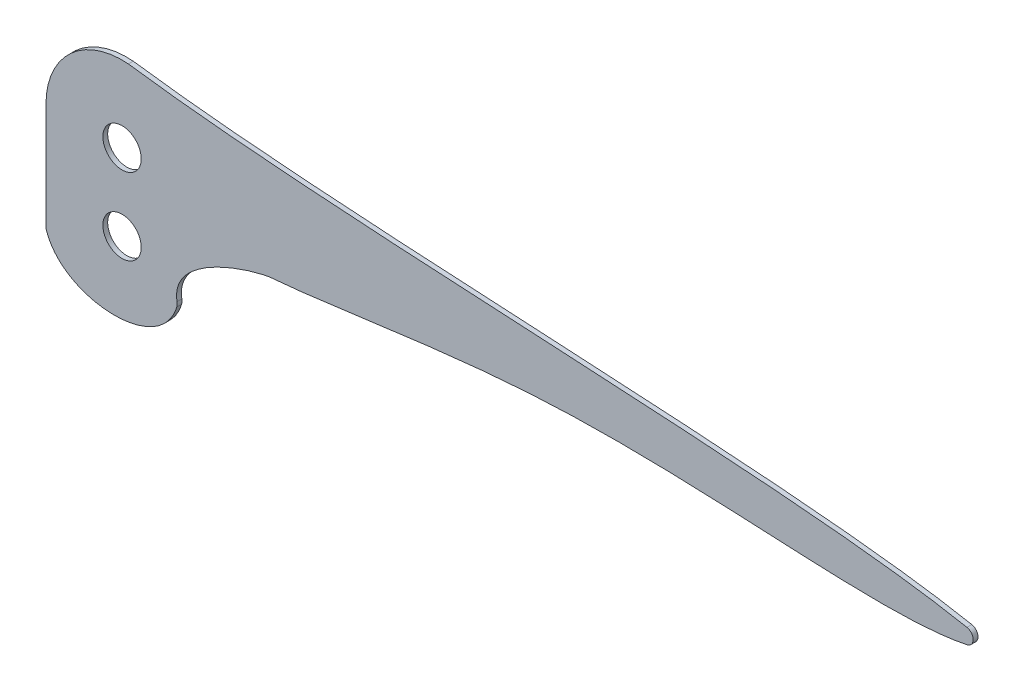
ISO-10303-21;
HEADER;
FILE_DESCRIPTION(('STEP AP214'),'2;1');
FILE_NAME('part.step','',(''),(''),'','','');
FILE_SCHEMA(('AUTOMOTIVE_DESIGN { 1 0 10303 214 1 1 1 1 }'));
ENDSEC;
DATA;
#1=APPLICATION_CONTEXT('core data for automotive mechanical design processes');
#2=APPLICATION_PROTOCOL_DEFINITION('international standard','automotive_design',2000,#1);
#3=PRODUCT_CONTEXT('',#1,'mechanical');
#4=PRODUCT('Part','Part','',(#3));
#5=PRODUCT_RELATED_PRODUCT_CATEGORY('part','',(#4));
#6=PRODUCT_DEFINITION_FORMATION('','',#4);
#7=PRODUCT_DEFINITION_CONTEXT('part definition',#1,'design');
#8=PRODUCT_DEFINITION('design','',#6,#7);
#9=PRODUCT_DEFINITION_SHAPE('','',#8);
#10=(LENGTH_UNIT() NAMED_UNIT(*) SI_UNIT(.MILLI.,.METRE.));
#11=(NAMED_UNIT(*) PLANE_ANGLE_UNIT() SI_UNIT($,.RADIAN.));
#12=(NAMED_UNIT(*) SI_UNIT($,.STERADIAN.) SOLID_ANGLE_UNIT());
#13=UNCERTAINTY_MEASURE_WITH_UNIT(LENGTH_MEASURE(1.E-05),#10,'distance_accuracy_value','');
#14=(GEOMETRIC_REPRESENTATION_CONTEXT(3) GLOBAL_UNCERTAINTY_ASSIGNED_CONTEXT((#13)) GLOBAL_UNIT_ASSIGNED_CONTEXT((#10,
#11,#12)) REPRESENTATION_CONTEXT('',''));
#15=CARTESIAN_POINT('',(0.,0.,0.));
#16=DIRECTION('',(0.,0.,1.));
#17=DIRECTION('',(1.,0.,0.));
#18=AXIS2_PLACEMENT_3D('',#15,#16,#17);
#19=CARTESIAN_POINT('',(-21.7830142284969,-35.2153561322036,1.6002));
#20=DIRECTION('',(0.,0.,-1.));
#21=DIRECTION('',(-1.,0.,0.));
#22=AXIS2_PLACEMENT_3D('',#19,#20,#21);
#23=CYLINDRICAL_SURFACE('',#22,3.40886159957342);
#24=CARTESIAN_POINT('',(-21.7830142284969,-35.2153561322036,0.));
#25=DIRECTION('',(0.,0.,1.));
#26=DIRECTION('',(1.,0.,0.));
#27=AXIS2_PLACEMENT_3D('',#24,#25,#26);
#28=CIRCLE('',#27,3.40886159957342);
#29=CARTESIAN_POINT('',(-25.1918758280703,-35.2153561322036,0.));
#30=VERTEX_POINT('',#29);
#31=CARTESIAN_POINT('',(-25.0040639994122,-36.3312305777991,0.));
#32=VERTEX_POINT('',#31);
#33=EDGE_CURVE('E229',#30,#32,#28,.T.);
#34=ORIENTED_EDGE('',*,*,#33,.T.);
#35=DIRECTION('',(0.,0.,-1.));
#36=VECTOR('',#35,1.);
#37=CARTESIAN_POINT('',(-25.0040639994122,-36.3312305777991,1.6002));
#38=LINE('',#37,#36);
#39=CARTESIAN_POINT('',(-25.0040639994122,-36.3312305777991,1.6002));
#40=VERTEX_POINT('',#39);
#41=EDGE_CURVE('E11',#40,#32,#38,.T.);
#42=ORIENTED_EDGE('',*,*,#41,.F.);
#43=CARTESIAN_POINT('',(-21.7830142284969,-35.2153561322036,1.6002));
#44=DIRECTION('',(0.,0.,1.));
#45=DIRECTION('',(1.,0.,0.));
#46=AXIS2_PLACEMENT_3D('',#43,#44,#45);
#47=CIRCLE('',#46,3.40886159957342);
#48=CARTESIAN_POINT('',(-25.1918758280703,-35.2153561322036,1.6002));
#49=VERTEX_POINT('',#48);
#50=EDGE_CURVE('E199',#49,#40,#47,.T.);
#51=ORIENTED_EDGE('',*,*,#50,.F.);
#52=DIRECTION('',(0.,0.,-1.));
#53=VECTOR('',#52,1.);
#54=CARTESIAN_POINT('',(-25.1918758280703,-35.2153561322036,1.6002));
#55=LINE('',#54,#53);
#56=EDGE_CURVE('E285',#49,#30,#55,.T.);
#57=ORIENTED_EDGE('',*,*,#56,.T.);
#58=EDGE_LOOP('',(#34,#42,#51,#57));
#59=FACE_BOUND('',#58,.T.);
#60=ADVANCED_FACE('F45',(#59),#23,.T.);
#61=CARTESIAN_POINT('',(-25.0040639994122,-36.3312305777991,1.6002));
#62=CARTESIAN_POINT('',(-24.3021615841236,-38.3573210782978,1.6002));
#63=CARTESIAN_POINT('',(-17.5003456931417,-49.472928078138,1.6002));
#64=CARTESIAN_POINT('',(6.48656543885454,-52.3530170341493,1.6002));
#65=CARTESIAN_POINT('',(16.8282572081742,-40.8908085866762,1.6002));
#66=CARTESIAN_POINT('',(18.1176182015623,-36.6407317946481,1.6002));
#67=B_SPLINE_CURVE_WITH_KNOTS('',3,(#61,#62,#63,#64,#65,#66),.UNSPECIFIED.,.F.,.F.,(4,1,1,4),
(0.0112860639960706,0.130987572011759,0.750185473894077,0.983991620512454),.UNSPECIFIED.);
#68=DIRECTION('',(0.,0.,-1.));
#69=VECTOR('',#68,1.);
#70=SURFACE_OF_LINEAR_EXTRUSION('',#67,#69);
#71=CARTESIAN_POINT('',(-25.0040639994122,-36.3312305777991,0.));
#72=CARTESIAN_POINT('',(-24.3021615841236,-38.3573210782978,0.));
#73=CARTESIAN_POINT('',(-17.5003456931417,-49.472928078138,0.));
#74=CARTESIAN_POINT('',(6.48656543885454,-52.3530170341493,0.));
#75=CARTESIAN_POINT('',(16.8282572081742,-40.8908085866762,0.));
#76=CARTESIAN_POINT('',(18.1176182015623,-36.6407317946481,0.));
#77=B_SPLINE_CURVE_WITH_KNOTS('',3,(#71,#72,#73,#74,#75,#76),.UNSPECIFIED.,.F.,.F.,(4,1,1,4),
(0.0112860639960706,0.130987572011759,0.750185473894077,0.983991620512454),.UNSPECIFIED.);
#78=CARTESIAN_POINT('',(18.1176182015623,-36.6407317946481,0.));
#79=VERTEX_POINT('',#78);
#80=EDGE_CURVE('E235',#32,#79,#77,.T.);
#81=ORIENTED_EDGE('',*,*,#80,.T.);
#82=DIRECTION('',(0.,0.,-1.));
#83=VECTOR('',#82,1.);
#84=CARTESIAN_POINT('',(18.1176182015623,-36.6407317946481,1.6002));
#85=LINE('',#84,#83);
#86=CARTESIAN_POINT('',(18.1176182015623,-36.6407317946481,1.6002));
#87=VERTEX_POINT('',#86);
#88=EDGE_CURVE('E55',#87,#79,#85,.T.);
#89=ORIENTED_EDGE('',*,*,#88,.F.);
#90=EDGE_CURVE('E108',#40,#87,#67,.T.);
#91=ORIENTED_EDGE('',*,*,#90,.F.);
#92=ORIENTED_EDGE('',*,*,#41,.T.);
#93=EDGE_LOOP('',(#81,#89,#91,#92));
#94=FACE_BOUND('',#93,.T.);
#95=ADVANCED_FACE('F205',(#94),#70,.F.);
#96=CARTESIAN_POINT('',(14.8555654072512,-35.6511111743227,1.6002));
#97=DIRECTION('',(0.,0.,-1.));
#98=DIRECTION('',(-1.,0.,0.));
#99=AXIS2_PLACEMENT_3D('',#96,#97,#98);
#100=CYLINDRICAL_SURFACE('',#99,3.40886159957342);
#101=CARTESIAN_POINT('',(14.8555654072512,-35.6511111743227,0.));
#102=DIRECTION('',(0.,0.,1.));
#103=DIRECTION('',(1.,0.,0.));
#104=AXIS2_PLACEMENT_3D('',#101,#102,#103);
#105=CIRCLE('',#104,3.40886159957342);
#106=CARTESIAN_POINT('',(18.2121526534088,-35.0564184267813,0.));
#107=VERTEX_POINT('',#106);
#108=EDGE_CURVE('E245',#107,#79,#105,.F.);
#109=ORIENTED_EDGE('',*,*,#108,.F.);
#110=DIRECTION('',(0.,0.,-1.));
#111=VECTOR('',#110,1.);
#112=CARTESIAN_POINT('',(18.2121526534088,-35.0564184267813,1.6002));
#113=LINE('',#112,#111);
#114=CARTESIAN_POINT('',(18.2121526534088,-35.0564184267813,1.6002));
#115=VERTEX_POINT('',#114);
#116=EDGE_CURVE('E299',#115,#107,#113,.T.);
#117=ORIENTED_EDGE('',*,*,#116,.F.);
#118=CARTESIAN_POINT('',(14.8555654072512,-35.6511111743227,1.6002));
#119=DIRECTION('',(0.,0.,1.));
#120=DIRECTION('',(1.,0.,0.));
#121=AXIS2_PLACEMENT_3D('',#118,#119,#120);
#122=CIRCLE('',#121,3.40886159957342);
#123=EDGE_CURVE('E187',#115,#87,#122,.F.);
#124=ORIENTED_EDGE('',*,*,#123,.T.);
#125=ORIENTED_EDGE('',*,*,#88,.T.);
#126=EDGE_LOOP('',(#109,#117,#124,#125));
#127=FACE_BOUND('',#126,.T.);
#128=ADVANCED_FACE('F208',(#127),#100,.T.);
#129=CARTESIAN_POINT('',(18.2121526534088,-35.0564184267813,1.6002));
#130=CARTESIAN_POINT('',(15.7223276167545,-21.003254002382,1.6002));
#131=CARTESIAN_POINT('',(45.0837049137955,-12.5773878637125,1.6002));
#132=CARTESIAN_POINT('',(50.3146213111815,-12.4877868054011,1.6002));
#133=B_SPLINE_CURVE_WITH_KNOTS('',3,(#129,#130,#131,#132),.UNSPECIFIED.,.F.,.F.,(4,4),
(0.243688719110839,1.),.UNSPECIFIED.);
#134=DIRECTION('',(0.,0.,-1.));
#135=VECTOR('',#134,1.);
#136=SURFACE_OF_LINEAR_EXTRUSION('',#133,#135);
#137=CARTESIAN_POINT('',(18.2121526534088,-35.0564184267813,0.));
#138=CARTESIAN_POINT('',(15.7223276167545,-21.003254002382,0.));
#139=CARTESIAN_POINT('',(45.0837049137955,-12.5773878637125,0.));
#140=CARTESIAN_POINT('',(50.3146213111815,-12.4877868054011,0.));
#141=B_SPLINE_CURVE_WITH_KNOTS('',3,(#137,#138,#139,#140),.UNSPECIFIED.,.F.,.F.,(4,4),
(0.243688719110839,1.),.UNSPECIFIED.);
#142=CARTESIAN_POINT('',(50.3146213111815,-12.4877868054011,0.));
#143=VERTEX_POINT('',#142);
#144=EDGE_CURVE('E252',#107,#143,#141,.T.);
#145=ORIENTED_EDGE('',*,*,#144,.T.);
#146=DIRECTION('',(0.,0.,-1.));
#147=VECTOR('',#146,1.);
#148=CARTESIAN_POINT('',(50.3146213111815,-12.4877868054011,1.6002));
#149=LINE('',#148,#147);
#150=CARTESIAN_POINT('',(50.3146213111815,-12.4877868054011,1.6002));
#151=VERTEX_POINT('',#150);
#152=EDGE_CURVE('E295',#151,#143,#149,.T.);
#153=ORIENTED_EDGE('',*,*,#152,.F.);
#154=EDGE_CURVE('E178',#115,#151,#133,.T.);
#155=ORIENTED_EDGE('',*,*,#154,.F.);
#156=ORIENTED_EDGE('',*,*,#116,.T.);
#157=EDGE_LOOP('',(#145,#153,#155,#156));
#158=FACE_BOUND('',#157,.T.);
#159=ADVANCED_FACE('F170',(#158),#136,.F.);
#160=CARTESIAN_POINT('',(50.3146213111815,-12.4877868054011,1.6002));
#161=CARTESIAN_POINT('',(67.8289697621695,-11.2173535629371,1.6002));
#162=CARTESIAN_POINT('',(162.851239242517,6.09744582946119,1.6002));
#163=CARTESIAN_POINT('',(250.038282618388,-9.04178446775124,1.6002));
#164=CARTESIAN_POINT('',(279.934807734872,-2.60259209348189,1.6002));
#165=B_SPLINE_CURVE_WITH_KNOTS('',3,(#160,#161,#162,#163,#164),.UNSPECIFIED.,.F.,.F.,(4,1,4),
(0.235845719639899,0.495200791921885,0.941477436545463),.UNSPECIFIED.);
#166=DIRECTION('',(0.,0.,-1.));
#167=VECTOR('',#166,1.);
#168=SURFACE_OF_LINEAR_EXTRUSION('',#165,#167);
#169=CARTESIAN_POINT('',(50.3146213111815,-12.4877868054011,0.));
#170=CARTESIAN_POINT('',(67.8289697621695,-11.2173535629371,0.));
#171=CARTESIAN_POINT('',(162.851239242517,6.09744582946119,0.));
#172=CARTESIAN_POINT('',(250.038282618388,-9.04178446775124,0.));
#173=CARTESIAN_POINT('',(279.934807734872,-2.60259209348189,0.));
#174=B_SPLINE_CURVE_WITH_KNOTS('',3,(#169,#170,#171,#172,#173),.UNSPECIFIED.,.F.,.F.,(4,1,4),
(0.235845719639899,0.495200791921885,0.941477436545463),.UNSPECIFIED.);
#175=CARTESIAN_POINT('',(279.934807734872,-2.60259209348189,0.));
#176=VERTEX_POINT('',#175);
#177=EDGE_CURVE('E257',#143,#176,#174,.T.);
#178=ORIENTED_EDGE('',*,*,#177,.T.);
#179=DIRECTION('',(0.,0.,-1.));
#180=VECTOR('',#179,1.);
#181=CARTESIAN_POINT('',(279.934807734872,-2.60259209348189,1.6002));
#182=LINE('',#181,#180);
#183=CARTESIAN_POINT('',(279.934807734872,-2.60259209348189,1.6002));
#184=VERTEX_POINT('',#183);
#185=EDGE_CURVE('E292',#184,#176,#182,.T.);
#186=ORIENTED_EDGE('',*,*,#185,.F.);
#187=EDGE_CURVE('E148',#151,#184,#165,.T.);
#188=ORIENTED_EDGE('',*,*,#187,.F.);
#189=ORIENTED_EDGE('',*,*,#152,.T.);
#190=EDGE_LOOP('',(#178,#186,#188,#189));
#191=FACE_BOUND('',#190,.T.);
#192=ADVANCED_FACE('F166',(#191),#168,.F.);
#193=CARTESIAN_POINT('',(279.4,-0.119533357422495,1.6002));
#194=DIRECTION('',(0.,0.,-1.));
#195=DIRECTION('',(-1.,0.,0.));
#196=AXIS2_PLACEMENT_3D('',#193,#194,#195);
#197=CYLINDRICAL_SURFACE('',#196,2.54);
#198=CARTESIAN_POINT('',(279.4,-0.119533357422495,0.));
#199=DIRECTION('',(0.,0.,1.));
#200=DIRECTION('',(1.,0.,0.));
#201=AXIS2_PLACEMENT_3D('',#198,#199,#200);
#202=CIRCLE('',#201,2.54);
#203=CARTESIAN_POINT('',(279.889362487852,2.37288000225196,0.));
#204=VERTEX_POINT('',#203);
#205=EDGE_CURVE('E266',#204,#176,#202,.F.);
#206=ORIENTED_EDGE('',*,*,#205,.F.);
#207=DIRECTION('',(0.,0.,-1.));
#208=VECTOR('',#207,1.);
#209=CARTESIAN_POINT('',(279.889362487852,2.37288000225196,1.6002));
#210=LINE('',#209,#208);
#211=CARTESIAN_POINT('',(279.889362487852,2.37288000225196,1.6002));
#212=VERTEX_POINT('',#211);
#213=EDGE_CURVE('E134',#212,#204,#210,.T.);
#214=ORIENTED_EDGE('',*,*,#213,.F.);
#215=CARTESIAN_POINT('',(279.4,-0.119533357422495,1.6002));
#216=DIRECTION('',(0.,0.,1.));
#217=DIRECTION('',(1.,0.,0.));
#218=AXIS2_PLACEMENT_3D('',#215,#216,#217);
#219=CIRCLE('',#218,2.54);
#220=EDGE_CURVE('E144',#212,#184,#219,.F.);
#221=ORIENTED_EDGE('',*,*,#220,.T.);
#222=ORIENTED_EDGE('',*,*,#185,.T.);
#223=EDGE_LOOP('',(#206,#214,#221,#222));
#224=FACE_BOUND('',#223,.T.);
#225=ADVANCED_FACE('F162',(#224),#197,.T.);
#226=CARTESIAN_POINT('',(2.09020490747812,25.105012471251,1.6002));
#227=CARTESIAN_POINT('',(29.3726338816965,21.318909317899,1.6002));
#228=CARTESIAN_POINT('',(128.041674084035,14.5405727250675,1.6002));
#229=CARTESIAN_POINT('',(239.54841130922,10.2934555177246,1.6002));
#230=CARTESIAN_POINT('',(279.889362487852,2.37288000225196,1.6002));
#231=B_SPLINE_CURVE_WITH_KNOTS('',3,(#226,#227,#228,#229,#230),.UNSPECIFIED.,.F.,.F.,(4,1,4),
(0.0085434687900943,0.340594683701158,0.941395149998142),.UNSPECIFIED.);
#232=DIRECTION('',(0.,0.,-1.));
#233=VECTOR('',#232,1.);
#234=SURFACE_OF_LINEAR_EXTRUSION('',#231,#233);
#235=CARTESIAN_POINT('',(2.09020490747812,25.105012471251,0.));
#236=CARTESIAN_POINT('',(29.3726338816965,21.318909317899,0.));
#237=CARTESIAN_POINT('',(128.041674084035,14.5405727250675,0.));
#238=CARTESIAN_POINT('',(239.54841130922,10.2934555177246,0.));
#239=CARTESIAN_POINT('',(279.889362487852,2.37288000225196,0.));
#240=B_SPLINE_CURVE_WITH_KNOTS('',3,(#235,#236,#237,#238,#239),.UNSPECIFIED.,.F.,.F.,(4,1,4),
(0.0085434687900943,0.340594683701158,0.941395149998142),.UNSPECIFIED.);
#241=CARTESIAN_POINT('',(2.09020490747812,25.105012471251,0.));
#242=VERTEX_POINT('',#241);
#243=EDGE_CURVE('E132',#242,#204,#240,.T.);
#244=ORIENTED_EDGE('',*,*,#243,.F.);
#245=DIRECTION('',(0.,0.,-1.));
#246=VECTOR('',#245,1.);
#247=CARTESIAN_POINT('',(2.09020490747812,25.105012471251,1.6002));
#248=LINE('',#247,#246);
#249=CARTESIAN_POINT('',(2.09020490747812,25.105012471251,1.6002));
#250=VERTEX_POINT('',#249);
#251=EDGE_CURVE('E126',#250,#242,#248,.T.);
#252=ORIENTED_EDGE('',*,*,#251,.F.);
#253=EDGE_CURVE('E130',#250,#212,#231,.T.);
#254=ORIENTED_EDGE('',*,*,#253,.T.);
#255=ORIENTED_EDGE('',*,*,#213,.T.);
#256=EDGE_LOOP('',(#244,#252,#254,#255));
#257=FACE_BOUND('',#256,.T.);
#258=ADVANCED_FACE('F128',(#257),#234,.T.);
#259=CARTESIAN_POINT('',(0.,0.,1.6002));
#260=DIRECTION('',(0.,0.,-1.));
#261=DIRECTION('',(-1.,0.,0.));
#262=AXIS2_PLACEMENT_3D('',#259,#260,#261);
#263=CYLINDRICAL_SURFACE('',#262,25.1918758280703);
#264=CARTESIAN_POINT('',(0.,0.,0.));
#265=DIRECTION('',(0.,0.,1.));
#266=DIRECTION('',(1.,0.,0.));
#267=AXIS2_PLACEMENT_3D('',#264,#265,#266);
#268=CIRCLE('',#267,25.1918758280703);
#269=CARTESIAN_POINT('',(-25.1918758280703,0.,0.));
#270=VERTEX_POINT('',#269);
#271=EDGE_CURVE('E94',#242,#270,#268,.T.);
#272=ORIENTED_EDGE('',*,*,#271,.T.);
#273=DIRECTION('',(0.,0.,-1.));
#274=VECTOR('',#273,1.);
#275=CARTESIAN_POINT('',(-25.1918758280703,0.,1.6002));
#276=LINE('',#275,#274);
#277=CARTESIAN_POINT('',(-25.1918758280703,0.,1.6002));
#278=VERTEX_POINT('',#277);
#279=EDGE_CURVE('E135',#278,#270,#276,.T.);
#280=ORIENTED_EDGE('',*,*,#279,.F.);
#281=CARTESIAN_POINT('',(0.,0.,1.6002));
#282=DIRECTION('',(0.,0.,1.));
#283=DIRECTION('',(1.,0.,0.));
#284=AXIS2_PLACEMENT_3D('',#281,#282,#283);
#285=CIRCLE('',#284,25.1918758280703);
#286=EDGE_CURVE('E137',#250,#278,#285,.T.);
#287=ORIENTED_EDGE('',*,*,#286,.F.);
#288=ORIENTED_EDGE('',*,*,#251,.T.);
#289=EDGE_LOOP('',(#272,#280,#287,#288));
#290=FACE_BOUND('',#289,.T.);
#291=ADVANCED_FACE('F138',(#290),#263,.T.);
#292=CARTESIAN_POINT('',(0.,0.,1.6002));
#293=DIRECTION('',(0.,0.,-1.));
#294=DIRECTION('',(-1.,0.,0.));
#295=AXIS2_PLACEMENT_3D('',#292,#293,#294);
#296=CYLINDRICAL_SURFACE('',#295,6.35);
#297=CARTESIAN_POINT('',(0.,0.,1.6002));
#298=DIRECTION('',(0.,0.,1.));
#299=DIRECTION('',(1.,0.,0.));
#300=AXIS2_PLACEMENT_3D('',#297,#298,#299);
#301=CIRCLE('',#300,6.35);
#302=CARTESIAN_POINT('',(6.35,0.,1.6002));
#303=VERTEX_POINT('',#302);
#304=EDGE_CURVE('E223',#303,#303,#301,.T.);
#305=ORIENTED_EDGE('',*,*,#304,.T.);
#306=EDGE_LOOP('',(#305));
#307=FACE_BOUND('',#306,.T.);
#308=CARTESIAN_POINT('',(0.,0.,0.));
#309=DIRECTION('',(0.,0.,1.));
#310=DIRECTION('',(1.,0.,0.));
#311=AXIS2_PLACEMENT_3D('',#308,#309,#310);
#312=CIRCLE('',#311,6.35);
#313=CARTESIAN_POINT('',(6.35,0.,0.));
#314=VERTEX_POINT('',#313);
#315=EDGE_CURVE('E226',#314,#314,#312,.T.);
#316=ORIENTED_EDGE('',*,*,#315,.F.);
#317=EDGE_LOOP('',(#316));
#318=FACE_BOUND('',#317,.T.);
#319=ADVANCED_FACE('F211',(#307,#318),#296,.F.);
#320=CARTESIAN_POINT('',(0.,-25.4,1.6002));
#321=DIRECTION('',(0.,0.,-1.));
#322=DIRECTION('',(-1.,0.,0.));
#323=AXIS2_PLACEMENT_3D('',#320,#321,#322);
#324=CYLINDRICAL_SURFACE('',#323,6.35);
#325=CARTESIAN_POINT('',(0.,-25.4,1.6002));
#326=DIRECTION('',(0.,0.,1.));
#327=DIRECTION('',(1.,0.,0.));
#328=AXIS2_PLACEMENT_3D('',#325,#326,#327);
#329=CIRCLE('',#328,6.35);
#330=CARTESIAN_POINT('',(6.35,-25.4,1.6002));
#331=VERTEX_POINT('',#330);
#332=EDGE_CURVE('E284',#331,#331,#329,.T.);
#333=ORIENTED_EDGE('',*,*,#332,.T.);
#334=EDGE_LOOP('',(#333));
#335=FACE_BOUND('',#334,.T.);
#336=CARTESIAN_POINT('',(0.,-25.4,0.));
#337=DIRECTION('',(0.,0.,1.));
#338=DIRECTION('',(1.,0.,0.));
#339=AXIS2_PLACEMENT_3D('',#336,#337,#338);
#340=CIRCLE('',#339,6.35);
#341=CARTESIAN_POINT('',(6.35,-25.4,0.));
#342=VERTEX_POINT('',#341);
#343=EDGE_CURVE('E230',#342,#342,#340,.T.);
#344=ORIENTED_EDGE('',*,*,#343,.F.);
#345=EDGE_LOOP('',(#344));
#346=FACE_BOUND('',#345,.T.);
#347=ADVANCED_FACE('F47',(#335,#346),#324,.F.);
#348=CARTESIAN_POINT('',(-25.1918758280703,0.,1.6002));
#349=DIRECTION('',(1.,0.,0.));
#350=DIRECTION('',(0.,0.,-1.));
#351=AXIS2_PLACEMENT_3D('',#348,#349,#350);
#352=PLANE('',#351);
#353=DIRECTION('',(0.,-1.,0.));
#354=VECTOR('',#353,1.);
#355=CARTESIAN_POINT('',(-25.1918758280703,0.,0.));
#356=LINE('',#355,#354);
#357=EDGE_CURVE('E100',#270,#30,#356,.T.);
#358=ORIENTED_EDGE('',*,*,#357,.T.);
#359=ORIENTED_EDGE('',*,*,#56,.F.);
#360=DIRECTION('',(0.,-1.,0.));
#361=VECTOR('',#360,1.);
#362=CARTESIAN_POINT('',(-25.1918758280703,0.,1.6002));
#363=LINE('',#362,#361);
#364=EDGE_CURVE('E63',#278,#49,#363,.T.);
#365=ORIENTED_EDGE('',*,*,#364,.F.);
#366=ORIENTED_EDGE('',*,*,#279,.T.);
#367=EDGE_LOOP('',(#358,#359,#365,#366));
#368=FACE_BOUND('',#367,.T.);
#369=ADVANCED_FACE('F218',(#368),#352,.F.);
#370=CARTESIAN_POINT('',(0.,0.,1.6002));
#371=DIRECTION('',(0.,0.,1.));
#372=DIRECTION('',(1.,0.,0.));
#373=AXIS2_PLACEMENT_3D('',#370,#371,#372);
#374=PLANE('',#373);
#375=ORIENTED_EDGE('',*,*,#332,.F.);
#376=EDGE_LOOP('',(#375));
#377=FACE_BOUND('',#376,.T.);
#378=ORIENTED_EDGE('',*,*,#304,.F.);
#379=EDGE_LOOP('',(#378));
#380=FACE_BOUND('',#379,.T.);
#381=ORIENTED_EDGE('',*,*,#50,.T.);
#382=ORIENTED_EDGE('',*,*,#90,.T.);
#383=ORIENTED_EDGE('',*,*,#123,.F.);
#384=ORIENTED_EDGE('',*,*,#154,.T.);
#385=ORIENTED_EDGE('',*,*,#187,.T.);
#386=ORIENTED_EDGE('',*,*,#220,.F.);
#387=ORIENTED_EDGE('',*,*,#253,.F.);
#388=ORIENTED_EDGE('',*,*,#286,.T.);
#389=ORIENTED_EDGE('',*,*,#364,.T.);
#390=EDGE_LOOP('',(#381,#382,#383,#384,#385,#386,#387,#388,#389));
#391=FACE_BOUND('',#390,.T.);
#392=ADVANCED_FACE('F142',(#377,#380,#391),#374,.T.);
#393=CARTESIAN_POINT('',(0.,0.,0.));
#394=DIRECTION('',(0.,0.,1.));
#395=DIRECTION('',(1.,0.,0.));
#396=AXIS2_PLACEMENT_3D('',#393,#394,#395);
#397=PLANE('',#396);
#398=ORIENTED_EDGE('',*,*,#343,.T.);
#399=EDGE_LOOP('',(#398));
#400=FACE_BOUND('',#399,.T.);
#401=ORIENTED_EDGE('',*,*,#315,.T.);
#402=EDGE_LOOP('',(#401));
#403=FACE_BOUND('',#402,.T.);
#404=ORIENTED_EDGE('',*,*,#33,.F.);
#405=ORIENTED_EDGE('',*,*,#357,.F.);
#406=ORIENTED_EDGE('',*,*,#271,.F.);
#407=ORIENTED_EDGE('',*,*,#243,.T.);
#408=ORIENTED_EDGE('',*,*,#205,.T.);
#409=ORIENTED_EDGE('',*,*,#177,.F.);
#410=ORIENTED_EDGE('',*,*,#144,.F.);
#411=ORIENTED_EDGE('',*,*,#108,.T.);
#412=ORIENTED_EDGE('',*,*,#80,.F.);
#413=EDGE_LOOP('',(#404,#405,#406,#407,#408,#409,#410,#411,#412));
#414=FACE_BOUND('',#413,.T.);
#415=ADVANCED_FACE('F309',(#400,#403,#414),#397,.F.);
#416=CLOSED_SHELL('',(#60,#95,#128,#159,#192,#225,#258,#291,#319,#347,#369,#392,#415));
#417=MANIFOLD_SOLID_BREP('B2',#416);
#418=ADVANCED_BREP_SHAPE_REPRESENTATION('',(#18,#417),#14);
#419=SHAPE_DEFINITION_REPRESENTATION(#9,#418);
ENDSEC;
END-ISO-10303-21;
